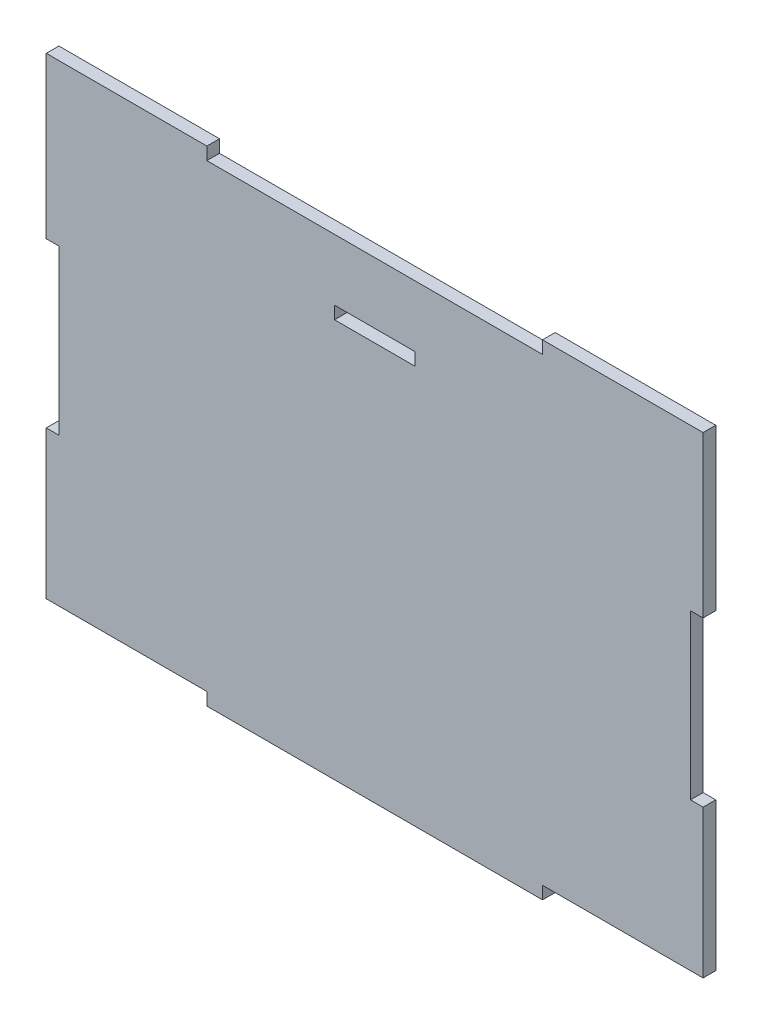
ISO-10303-21;
HEADER;
FILE_DESCRIPTION(('STEP AP214'),'2;1');
FILE_NAME('part.step','',(''),(''),'','','');
FILE_SCHEMA(('AUTOMOTIVE_DESIGN { 1 0 10303 214 1 1 1 1 }'));
ENDSEC;
DATA;
#1=APPLICATION_CONTEXT('core data for automotive mechanical design processes');
#2=APPLICATION_PROTOCOL_DEFINITION('international standard','automotive_design',2000,#1);
#3=PRODUCT_CONTEXT('',#1,'mechanical');
#4=PRODUCT('Part','Part','',(#3));
#5=PRODUCT_RELATED_PRODUCT_CATEGORY('part','',(#4));
#6=PRODUCT_DEFINITION_FORMATION('','',#4);
#7=PRODUCT_DEFINITION_CONTEXT('part definition',#1,'design');
#8=PRODUCT_DEFINITION('design','',#6,#7);
#9=PRODUCT_DEFINITION_SHAPE('','',#8);
#10=(LENGTH_UNIT() NAMED_UNIT(*) SI_UNIT(.MILLI.,.METRE.));
#11=(NAMED_UNIT(*) PLANE_ANGLE_UNIT() SI_UNIT($,.RADIAN.));
#12=(NAMED_UNIT(*) SI_UNIT($,.STERADIAN.) SOLID_ANGLE_UNIT());
#13=UNCERTAINTY_MEASURE_WITH_UNIT(LENGTH_MEASURE(1.E-05),#10,'distance_accuracy_value','');
#14=(GEOMETRIC_REPRESENTATION_CONTEXT(3) GLOBAL_UNCERTAINTY_ASSIGNED_CONTEXT((#13)) GLOBAL_UNIT_ASSIGNED_CONTEXT((#10,
#11,#12)) REPRESENTATION_CONTEXT('',''));
#15=CARTESIAN_POINT('',(0.,0.,0.));
#16=DIRECTION('',(0.,0.,1.));
#17=DIRECTION('',(1.,0.,0.));
#18=AXIS2_PLACEMENT_3D('',#15,#16,#17);
#19=CARTESIAN_POINT('',(0.,0.,2.));
#20=DIRECTION('',(0.,0.,-1.));
#21=DIRECTION('',(-1.,0.,0.));
#22=AXIS2_PLACEMENT_3D('',#19,#20,#21);
#23=PLANE('',#22);
#24=DIRECTION('',(0.,1.,0.));
#25=VECTOR('',#24,1.);
#26=CARTESIAN_POINT('',(51.943,12.954,2.));
#27=LINE('',#26,#25);
#28=CARTESIAN_POINT('',(51.943,12.954,2.));
#29=VERTEX_POINT('',#28);
#30=CARTESIAN_POINT('',(51.943,38.354,2.));
#31=VERTEX_POINT('',#30);
#32=EDGE_CURVE('E253',#29,#31,#27,.T.);
#33=ORIENTED_EDGE('',*,*,#32,.T.);
#34=DIRECTION('',(-1.,0.,0.));
#35=VECTOR('',#34,1.);
#36=CARTESIAN_POINT('',(26.543,38.354,2.));
#37=LINE('',#36,#35);
#38=CARTESIAN_POINT('',(26.543,38.354,2.));
#39=VERTEX_POINT('',#38);
#40=EDGE_CURVE('E257',#31,#39,#37,.T.);
#41=ORIENTED_EDGE('',*,*,#40,.T.);
#42=DIRECTION('',(0.,-1.,0.));
#43=VECTOR('',#42,1.);
#44=CARTESIAN_POINT('',(26.543,38.354,2.));
#45=LINE('',#44,#43);
#46=CARTESIAN_POINT('',(26.543,36.354,2.));
#47=VERTEX_POINT('',#46);
#48=EDGE_CURVE('E261',#39,#47,#45,.T.);
#49=ORIENTED_EDGE('',*,*,#48,.T.);
#50=DIRECTION('',(-1.,0.,0.));
#51=VECTOR('',#50,1.);
#52=CARTESIAN_POINT('',(-26.543,36.354,2.));
#53=LINE('',#52,#51);
#54=CARTESIAN_POINT('',(-26.543,36.354,2.));
#55=VERTEX_POINT('',#54);
#56=EDGE_CURVE('E264',#47,#55,#53,.T.);
#57=ORIENTED_EDGE('',*,*,#56,.T.);
#58=DIRECTION('',(0.,1.,0.));
#59=VECTOR('',#58,1.);
#60=CARTESIAN_POINT('',(-26.543,38.354,2.));
#61=LINE('',#60,#59);
#62=CARTESIAN_POINT('',(-26.543,38.354,2.));
#63=VERTEX_POINT('',#62);
#64=EDGE_CURVE('E267',#55,#63,#61,.T.);
#65=ORIENTED_EDGE('',*,*,#64,.T.);
#66=DIRECTION('',(-1.,0.,0.));
#67=VECTOR('',#66,1.);
#68=CARTESIAN_POINT('',(-51.943,38.354,2.));
#69=LINE('',#68,#67);
#70=CARTESIAN_POINT('',(-51.943,38.354,2.));
#71=VERTEX_POINT('',#70);
#72=EDGE_CURVE('E270',#63,#71,#69,.T.);
#73=ORIENTED_EDGE('',*,*,#72,.T.);
#74=DIRECTION('',(0.,-1.,0.));
#75=VECTOR('',#74,1.);
#76=CARTESIAN_POINT('',(-51.943,12.954,2.));
#77=LINE('',#76,#75);
#78=CARTESIAN_POINT('',(-51.943,12.954,2.));
#79=VERTEX_POINT('',#78);
#80=EDGE_CURVE('E273',#71,#79,#77,.T.);
#81=ORIENTED_EDGE('',*,*,#80,.T.);
#82=DIRECTION('',(1.,0.,0.));
#83=VECTOR('',#82,1.);
#84=CARTESIAN_POINT('',(-51.943,12.954,2.));
#85=LINE('',#84,#83);
#86=CARTESIAN_POINT('',(-49.943,12.954,2.));
#87=VERTEX_POINT('',#86);
#88=EDGE_CURVE('E276',#79,#87,#85,.T.);
#89=ORIENTED_EDGE('',*,*,#88,.T.);
#90=DIRECTION('',(0.,-1.,0.));
#91=VECTOR('',#90,1.);
#92=CARTESIAN_POINT('',(-49.943,-12.954,2.));
#93=LINE('',#92,#91);
#94=CARTESIAN_POINT('',(-49.943,-12.954,2.));
#95=VERTEX_POINT('',#94);
#96=EDGE_CURVE('E279',#87,#95,#93,.T.);
#97=ORIENTED_EDGE('',*,*,#96,.T.);
#98=DIRECTION('',(-1.,0.,0.));
#99=VECTOR('',#98,1.);
#100=CARTESIAN_POINT('',(-51.943,-12.954,2.));
#101=LINE('',#100,#99);
#102=CARTESIAN_POINT('',(-51.943,-12.954,2.));
#103=VERTEX_POINT('',#102);
#104=EDGE_CURVE('E282',#95,#103,#101,.T.);
#105=ORIENTED_EDGE('',*,*,#104,.T.);
#106=DIRECTION('',(0.,-1.,0.));
#107=VECTOR('',#106,1.);
#108=CARTESIAN_POINT('',(-51.943,-12.954,2.));
#109=LINE('',#108,#107);
#110=CARTESIAN_POINT('',(-51.943,-36.354,2.));
#111=VERTEX_POINT('',#110);
#112=EDGE_CURVE('E285',#103,#111,#109,.T.);
#113=ORIENTED_EDGE('',*,*,#112,.T.);
#114=DIRECTION('',(1.,0.,0.));
#115=VECTOR('',#114,1.);
#116=CARTESIAN_POINT('',(-51.943,-36.354,2.));
#117=LINE('',#116,#115);
#118=CARTESIAN_POINT('',(-26.543,-36.354,2.));
#119=VERTEX_POINT('',#118);
#120=EDGE_CURVE('E288',#111,#119,#117,.T.);
#121=ORIENTED_EDGE('',*,*,#120,.T.);
#122=DIRECTION('',(0.,-1.,0.));
#123=VECTOR('',#122,1.);
#124=CARTESIAN_POINT('',(-26.543,-36.354,2.));
#125=LINE('',#124,#123);
#126=CARTESIAN_POINT('',(-26.543,-38.354,2.));
#127=VERTEX_POINT('',#126);
#128=EDGE_CURVE('E291',#119,#127,#125,.T.);
#129=ORIENTED_EDGE('',*,*,#128,.T.);
#130=DIRECTION('',(1.,0.,0.));
#131=VECTOR('',#130,1.);
#132=CARTESIAN_POINT('',(-26.543,-38.354,2.));
#133=LINE('',#132,#131);
#134=CARTESIAN_POINT('',(26.543,-38.354,2.));
#135=VERTEX_POINT('',#134);
#136=EDGE_CURVE('E294',#127,#135,#133,.T.);
#137=ORIENTED_EDGE('',*,*,#136,.T.);
#138=DIRECTION('',(0.,1.,0.));
#139=VECTOR('',#138,1.);
#140=CARTESIAN_POINT('',(26.543,-36.354,2.));
#141=LINE('',#140,#139);
#142=CARTESIAN_POINT('',(26.543,-36.354,2.));
#143=VERTEX_POINT('',#142);
#144=EDGE_CURVE('E297',#135,#143,#141,.T.);
#145=ORIENTED_EDGE('',*,*,#144,.T.);
#146=DIRECTION('',(1.,0.,0.));
#147=VECTOR('',#146,1.);
#148=CARTESIAN_POINT('',(26.543,-36.354,2.));
#149=LINE('',#148,#147);
#150=CARTESIAN_POINT('',(51.943,-36.354,2.));
#151=VERTEX_POINT('',#150);
#152=EDGE_CURVE('E300',#143,#151,#149,.T.);
#153=ORIENTED_EDGE('',*,*,#152,.T.);
#154=DIRECTION('',(0.,1.,0.));
#155=VECTOR('',#154,1.);
#156=CARTESIAN_POINT('',(51.943,-36.354,2.));
#157=LINE('',#156,#155);
#158=CARTESIAN_POINT('',(51.943,-12.954,2.));
#159=VERTEX_POINT('',#158);
#160=EDGE_CURVE('E303',#151,#159,#157,.T.);
#161=ORIENTED_EDGE('',*,*,#160,.T.);
#162=DIRECTION('',(-1.,0.,0.));
#163=VECTOR('',#162,1.);
#164=CARTESIAN_POINT('',(49.943,-12.954,2.));
#165=LINE('',#164,#163);
#166=CARTESIAN_POINT('',(49.943,-12.954,2.));
#167=VERTEX_POINT('',#166);
#168=EDGE_CURVE('E306',#159,#167,#165,.T.);
#169=ORIENTED_EDGE('',*,*,#168,.T.);
#170=DIRECTION('',(0.,1.,0.));
#171=VECTOR('',#170,1.);
#172=CARTESIAN_POINT('',(49.943,-12.954,2.));
#173=LINE('',#172,#171);
#174=CARTESIAN_POINT('',(49.943,12.954,2.));
#175=VERTEX_POINT('',#174);
#176=EDGE_CURVE('E309',#167,#175,#173,.T.);
#177=ORIENTED_EDGE('',*,*,#176,.T.);
#178=DIRECTION('',(1.,0.,0.));
#179=VECTOR('',#178,1.);
#180=CARTESIAN_POINT('',(49.943,12.954,2.));
#181=LINE('',#180,#179);
#182=EDGE_CURVE('E312',#175,#29,#181,.T.);
#183=ORIENTED_EDGE('',*,*,#182,.T.);
#184=EDGE_LOOP('',(#33,#41,#49,#57,#65,#73,#81,#89,#97,#105,#113,#121,#129,#137,#145,#153,#161,
#169,#177,#183));
#185=FACE_BOUND('',#184,.T.);
#186=DIRECTION('',(0.,1.,0.));
#187=VECTOR('',#186,1.);
#188=CARTESIAN_POINT('',(6.35,24.654,2.));
#189=LINE('',#188,#187);
#190=CARTESIAN_POINT('',(6.35,24.654,2.));
#191=VERTEX_POINT('',#190);
#192=CARTESIAN_POINT('',(6.35,26.654,2.));
#193=VERTEX_POINT('',#192);
#194=EDGE_CURVE('E205',#191,#193,#189,.T.);
#195=ORIENTED_EDGE('',*,*,#194,.F.);
#196=DIRECTION('',(1.,0.,0.));
#197=VECTOR('',#196,1.);
#198=CARTESIAN_POINT('',(-6.34999999999999,24.654,2.));
#199=LINE('',#198,#197);
#200=CARTESIAN_POINT('',(-6.34999999999999,24.654,2.));
#201=VERTEX_POINT('',#200);
#202=EDGE_CURVE('E231',#201,#191,#199,.T.);
#203=ORIENTED_EDGE('',*,*,#202,.F.);
#204=DIRECTION('',(0.,-1.,0.));
#205=VECTOR('',#204,1.);
#206=CARTESIAN_POINT('',(-6.34999999999999,24.654,2.));
#207=LINE('',#206,#205);
#208=CARTESIAN_POINT('',(-6.34999999999999,26.654,2.));
#209=VERTEX_POINT('',#208);
#210=EDGE_CURVE('E227',#209,#201,#207,.T.);
#211=ORIENTED_EDGE('',*,*,#210,.F.);
#212=DIRECTION('',(-1.,0.,0.));
#213=VECTOR('',#212,1.);
#214=CARTESIAN_POINT('',(-6.34999999999999,26.654,2.));
#215=LINE('',#214,#213);
#216=EDGE_CURVE('E214',#193,#209,#215,.T.);
#217=ORIENTED_EDGE('',*,*,#216,.F.);
#218=EDGE_LOOP('',(#195,#203,#211,#217));
#219=FACE_BOUND('',#218,.T.);
#220=ADVANCED_FACE('F43',(#185,#219),#23,.F.);
#221=CARTESIAN_POINT('',(0.,0.,0.));
#222=DIRECTION('',(0.,0.,-1.));
#223=DIRECTION('',(-1.,0.,0.));
#224=AXIS2_PLACEMENT_3D('',#221,#222,#223);
#225=PLANE('',#224);
#226=DIRECTION('',(0.,1.,0.));
#227=VECTOR('',#226,1.);
#228=CARTESIAN_POINT('',(51.943,12.954,0.));
#229=LINE('',#228,#227);
#230=CARTESIAN_POINT('',(51.943,12.954,0.));
#231=VERTEX_POINT('',#230);
#232=CARTESIAN_POINT('',(51.943,38.354,0.));
#233=VERTEX_POINT('',#232);
#234=EDGE_CURVE('E223',#231,#233,#229,.T.);
#235=ORIENTED_EDGE('',*,*,#234,.F.);
#236=DIRECTION('',(1.,0.,0.));
#237=VECTOR('',#236,1.);
#238=CARTESIAN_POINT('',(49.943,12.954,0.));
#239=LINE('',#238,#237);
#240=CARTESIAN_POINT('',(49.943,12.954,0.));
#241=VERTEX_POINT('',#240);
#242=EDGE_CURVE('E258',#241,#231,#239,.T.);
#243=ORIENTED_EDGE('',*,*,#242,.F.);
#244=DIRECTION('',(0.,1.,0.));
#245=VECTOR('',#244,1.);
#246=CARTESIAN_POINT('',(49.943,-12.954,0.));
#247=LINE('',#246,#245);
#248=CARTESIAN_POINT('',(49.943,-12.954,0.));
#249=VERTEX_POINT('',#248);
#250=EDGE_CURVE('E372',#249,#241,#247,.T.);
#251=ORIENTED_EDGE('',*,*,#250,.F.);
#252=DIRECTION('',(-1.,0.,0.));
#253=VECTOR('',#252,1.);
#254=CARTESIAN_POINT('',(49.943,-12.954,0.));
#255=LINE('',#254,#253);
#256=CARTESIAN_POINT('',(51.943,-12.954,0.));
#257=VERTEX_POINT('',#256);
#258=EDGE_CURVE('E369',#257,#249,#255,.T.);
#259=ORIENTED_EDGE('',*,*,#258,.F.);
#260=DIRECTION('',(0.,1.,0.));
#261=VECTOR('',#260,1.);
#262=CARTESIAN_POINT('',(51.943,-36.354,0.));
#263=LINE('',#262,#261);
#264=CARTESIAN_POINT('',(51.943,-36.354,0.));
#265=VERTEX_POINT('',#264);
#266=EDGE_CURVE('E366',#265,#257,#263,.T.);
#267=ORIENTED_EDGE('',*,*,#266,.F.);
#268=DIRECTION('',(1.,0.,0.));
#269=VECTOR('',#268,1.);
#270=CARTESIAN_POINT('',(49.943,-36.354,0.));
#271=LINE('',#270,#269);
#272=CARTESIAN_POINT('',(26.543,-36.354,0.));
#273=VERTEX_POINT('',#272);
#274=EDGE_CURVE('E363',#273,#265,#271,.T.);
#275=ORIENTED_EDGE('',*,*,#274,.F.);
#276=DIRECTION('',(0.,1.,0.));
#277=VECTOR('',#276,1.);
#278=CARTESIAN_POINT('',(26.543,-36.354,0.));
#279=LINE('',#278,#277);
#280=CARTESIAN_POINT('',(26.543,-38.354,0.));
#281=VERTEX_POINT('',#280);
#282=EDGE_CURVE('E359',#281,#273,#279,.T.);
#283=ORIENTED_EDGE('',*,*,#282,.F.);
#284=DIRECTION('',(1.,0.,0.));
#285=VECTOR('',#284,1.);
#286=CARTESIAN_POINT('',(-26.543,-38.354,0.));
#287=LINE('',#286,#285);
#288=CARTESIAN_POINT('',(-26.543,-38.354,0.));
#289=VERTEX_POINT('',#288);
#290=EDGE_CURVE('E356',#289,#281,#287,.T.);
#291=ORIENTED_EDGE('',*,*,#290,.F.);
#292=DIRECTION('',(0.,-1.,0.));
#293=VECTOR('',#292,1.);
#294=CARTESIAN_POINT('',(-26.543,-36.354,0.));
#295=LINE('',#294,#293);
#296=CARTESIAN_POINT('',(-26.543,-36.354,0.));
#297=VERTEX_POINT('',#296);
#298=EDGE_CURVE('E353',#297,#289,#295,.T.);
#299=ORIENTED_EDGE('',*,*,#298,.F.);
#300=DIRECTION('',(1.,0.,0.));
#301=VECTOR('',#300,1.);
#302=CARTESIAN_POINT('',(-49.943,-36.354,0.));
#303=LINE('',#302,#301);
#304=CARTESIAN_POINT('',(-51.943,-36.354,0.));
#305=VERTEX_POINT('',#304);
#306=EDGE_CURVE('E350',#305,#297,#303,.T.);
#307=ORIENTED_EDGE('',*,*,#306,.F.);
#308=DIRECTION('',(0.,-1.,0.));
#309=VECTOR('',#308,1.);
#310=CARTESIAN_POINT('',(-51.943,-12.954,0.));
#311=LINE('',#310,#309);
#312=CARTESIAN_POINT('',(-51.943,-12.954,0.));
#313=VERTEX_POINT('',#312);
#314=EDGE_CURVE('E346',#313,#305,#311,.T.);
#315=ORIENTED_EDGE('',*,*,#314,.F.);
#316=DIRECTION('',(-1.,0.,0.));
#317=VECTOR('',#316,1.);
#318=CARTESIAN_POINT('',(-51.943,-12.954,0.));
#319=LINE('',#318,#317);
#320=CARTESIAN_POINT('',(-49.943,-12.954,0.));
#321=VERTEX_POINT('',#320);
#322=EDGE_CURVE('E343',#321,#313,#319,.T.);
#323=ORIENTED_EDGE('',*,*,#322,.F.);
#324=DIRECTION('',(0.,-1.,0.));
#325=VECTOR('',#324,1.);
#326=CARTESIAN_POINT('',(-49.943,-12.954,0.));
#327=LINE('',#326,#325);
#328=CARTESIAN_POINT('',(-49.943,12.954,0.));
#329=VERTEX_POINT('',#328);
#330=EDGE_CURVE('E340',#329,#321,#327,.T.);
#331=ORIENTED_EDGE('',*,*,#330,.F.);
#332=DIRECTION('',(1.,0.,0.));
#333=VECTOR('',#332,1.);
#334=CARTESIAN_POINT('',(-51.943,12.954,0.));
#335=LINE('',#334,#333);
#336=CARTESIAN_POINT('',(-51.943,12.954,0.));
#337=VERTEX_POINT('',#336);
#338=EDGE_CURVE('E337',#337,#329,#335,.T.);
#339=ORIENTED_EDGE('',*,*,#338,.F.);
#340=DIRECTION('',(0.,-1.,0.));
#341=VECTOR('',#340,1.);
#342=CARTESIAN_POINT('',(-51.943,12.954,0.));
#343=LINE('',#342,#341);
#344=CARTESIAN_POINT('',(-51.943,38.354,0.));
#345=VERTEX_POINT('',#344);
#346=EDGE_CURVE('E334',#345,#337,#343,.T.);
#347=ORIENTED_EDGE('',*,*,#346,.F.);
#348=DIRECTION('',(-1.,0.,0.));
#349=VECTOR('',#348,1.);
#350=CARTESIAN_POINT('',(-51.943,38.354,0.));
#351=LINE('',#350,#349);
#352=CARTESIAN_POINT('',(-26.543,38.354,0.));
#353=VERTEX_POINT('',#352);
#354=EDGE_CURVE('E331',#353,#345,#351,.T.);
#355=ORIENTED_EDGE('',*,*,#354,.F.);
#356=DIRECTION('',(0.,1.,0.));
#357=VECTOR('',#356,1.);
#358=CARTESIAN_POINT('',(-26.543,38.354,0.));
#359=LINE('',#358,#357);
#360=CARTESIAN_POINT('',(-26.543,36.354,0.));
#361=VERTEX_POINT('',#360);
#362=EDGE_CURVE('E328',#361,#353,#359,.T.);
#363=ORIENTED_EDGE('',*,*,#362,.F.);
#364=DIRECTION('',(-1.,0.,0.));
#365=VECTOR('',#364,1.);
#366=CARTESIAN_POINT('',(-26.543,36.354,0.));
#367=LINE('',#366,#365);
#368=CARTESIAN_POINT('',(26.543,36.354,0.));
#369=VERTEX_POINT('',#368);
#370=EDGE_CURVE('E325',#369,#361,#367,.T.);
#371=ORIENTED_EDGE('',*,*,#370,.F.);
#372=DIRECTION('',(0.,-1.,0.));
#373=VECTOR('',#372,1.);
#374=CARTESIAN_POINT('',(26.543,38.354,0.));
#375=LINE('',#374,#373);
#376=CARTESIAN_POINT('',(26.543,38.354,0.));
#377=VERTEX_POINT('',#376);
#378=EDGE_CURVE('E322',#377,#369,#375,.T.);
#379=ORIENTED_EDGE('',*,*,#378,.F.);
#380=DIRECTION('',(-1.,0.,0.));
#381=VECTOR('',#380,1.);
#382=CARTESIAN_POINT('',(26.543,38.354,0.));
#383=LINE('',#382,#381);
#384=EDGE_CURVE('E319',#233,#377,#383,.T.);
#385=ORIENTED_EDGE('',*,*,#384,.F.);
#386=EDGE_LOOP('',(#235,#243,#251,#259,#267,#275,#283,#291,#299,#307,#315,#323,#331,#339,#347,
#355,#363,#371,#379,#385));
#387=FACE_BOUND('',#386,.T.);
#388=DIRECTION('',(1.,0.,0.));
#389=VECTOR('',#388,1.);
#390=CARTESIAN_POINT('',(-6.34999999999999,24.654,0.));
#391=LINE('',#390,#389);
#392=CARTESIAN_POINT('',(-6.34999999999999,24.654,0.));
#393=VERTEX_POINT('',#392);
#394=CARTESIAN_POINT('',(6.35,24.654,0.));
#395=VERTEX_POINT('',#394);
#396=EDGE_CURVE('E215',#393,#395,#391,.T.);
#397=ORIENTED_EDGE('',*,*,#396,.T.);
#398=DIRECTION('',(0.,1.,0.));
#399=VECTOR('',#398,1.);
#400=CARTESIAN_POINT('',(6.35,24.654,0.));
#401=LINE('',#400,#399);
#402=CARTESIAN_POINT('',(6.35,26.654,0.));
#403=VERTEX_POINT('',#402);
#404=EDGE_CURVE('E67',#395,#403,#401,.T.);
#405=ORIENTED_EDGE('',*,*,#404,.T.);
#406=DIRECTION('',(-1.,0.,0.));
#407=VECTOR('',#406,1.);
#408=CARTESIAN_POINT('',(-6.34999999999999,26.654,0.));
#409=LINE('',#408,#407);
#410=CARTESIAN_POINT('',(-6.34999999999999,26.654,0.));
#411=VERTEX_POINT('',#410);
#412=EDGE_CURVE('E221',#403,#411,#409,.T.);
#413=ORIENTED_EDGE('',*,*,#412,.T.);
#414=DIRECTION('',(0.,-1.,0.));
#415=VECTOR('',#414,1.);
#416=CARTESIAN_POINT('',(-6.34999999999999,24.654,0.));
#417=LINE('',#416,#415);
#418=EDGE_CURVE('E240',#411,#393,#417,.T.);
#419=ORIENTED_EDGE('',*,*,#418,.T.);
#420=EDGE_LOOP('',(#397,#405,#413,#419));
#421=FACE_BOUND('',#420,.T.);
#422=ADVANCED_FACE('F459',(#387,#421),#225,.T.);
#423=CARTESIAN_POINT('',(51.943,12.954,2.));
#424=DIRECTION('',(-1.,0.,0.));
#425=DIRECTION('',(0.,-1.,0.));
#426=AXIS2_PLACEMENT_3D('',#423,#424,#425);
#427=PLANE('',#426);
#428=ORIENTED_EDGE('',*,*,#234,.T.);
#429=DIRECTION('',(0.,0.,-1.));
#430=VECTOR('',#429,1.);
#431=CARTESIAN_POINT('',(51.943,38.354,2.));
#432=LINE('',#431,#430);
#433=EDGE_CURVE('E11',#31,#233,#432,.T.);
#434=ORIENTED_EDGE('',*,*,#433,.F.);
#435=ORIENTED_EDGE('',*,*,#32,.F.);
#436=DIRECTION('',(0.,0.,-1.));
#437=VECTOR('',#436,1.);
#438=CARTESIAN_POINT('',(51.943,12.954,2.));
#439=LINE('',#438,#437);
#440=EDGE_CURVE('E315',#29,#231,#439,.T.);
#441=ORIENTED_EDGE('',*,*,#440,.T.);
#442=EDGE_LOOP('',(#428,#434,#435,#441));
#443=FACE_BOUND('',#442,.T.);
#444=ADVANCED_FACE('F45',(#443),#427,.F.);
#445=CARTESIAN_POINT('',(26.543,38.354,2.));
#446=DIRECTION('',(0.,-1.,0.));
#447=DIRECTION('',(0.,0.,-1.));
#448=AXIS2_PLACEMENT_3D('',#445,#446,#447);
#449=PLANE('',#448);
#450=ORIENTED_EDGE('',*,*,#384,.T.);
#451=DIRECTION('',(0.,0.,-1.));
#452=VECTOR('',#451,1.);
#453=CARTESIAN_POINT('',(26.543,38.354,2.));
#454=LINE('',#453,#452);
#455=EDGE_CURVE('E52',#39,#377,#454,.T.);
#456=ORIENTED_EDGE('',*,*,#455,.F.);
#457=ORIENTED_EDGE('',*,*,#40,.F.);
#458=ORIENTED_EDGE('',*,*,#433,.T.);
#459=EDGE_LOOP('',(#450,#456,#457,#458));
#460=FACE_BOUND('',#459,.T.);
#461=ADVANCED_FACE('F476',(#460),#449,.F.);
#462=CARTESIAN_POINT('',(26.543,38.354,2.));
#463=DIRECTION('',(1.,0.,0.));
#464=DIRECTION('',(0.,1.,0.));
#465=AXIS2_PLACEMENT_3D('',#462,#463,#464);
#466=PLANE('',#465);
#467=ORIENTED_EDGE('',*,*,#378,.T.);
#468=DIRECTION('',(0.,0.,-1.));
#469=VECTOR('',#468,1.);
#470=CARTESIAN_POINT('',(26.543,36.354,2.));
#471=LINE('',#470,#469);
#472=EDGE_CURVE('E444',#47,#369,#471,.T.);
#473=ORIENTED_EDGE('',*,*,#472,.F.);
#474=ORIENTED_EDGE('',*,*,#48,.F.);
#475=ORIENTED_EDGE('',*,*,#455,.T.);
#476=EDGE_LOOP('',(#467,#473,#474,#475));
#477=FACE_BOUND('',#476,.T.);
#478=ADVANCED_FACE('F453',(#477),#466,.F.);
#479=CARTESIAN_POINT('',(-26.543,36.354,2.));
#480=DIRECTION('',(0.,-1.,0.));
#481=DIRECTION('',(0.,0.,-1.));
#482=AXIS2_PLACEMENT_3D('',#479,#480,#481);
#483=PLANE('',#482);
#484=ORIENTED_EDGE('',*,*,#370,.T.);
#485=DIRECTION('',(0.,0.,-1.));
#486=VECTOR('',#485,1.);
#487=CARTESIAN_POINT('',(-26.543,36.354,2.));
#488=LINE('',#487,#486);
#489=EDGE_CURVE('E440',#55,#361,#488,.T.);
#490=ORIENTED_EDGE('',*,*,#489,.F.);
#491=ORIENTED_EDGE('',*,*,#56,.F.);
#492=ORIENTED_EDGE('',*,*,#472,.T.);
#493=EDGE_LOOP('',(#484,#490,#491,#492));
#494=FACE_BOUND('',#493,.T.);
#495=ADVANCED_FACE('F465',(#494),#483,.F.);
#496=CARTESIAN_POINT('',(-26.543,38.354,2.));
#497=DIRECTION('',(-1.,0.,0.));
#498=DIRECTION('',(0.,0.,1.));
#499=AXIS2_PLACEMENT_3D('',#496,#497,#498);
#500=PLANE('',#499);
#501=ORIENTED_EDGE('',*,*,#362,.T.);
#502=DIRECTION('',(0.,0.,-1.));
#503=VECTOR('',#502,1.);
#504=CARTESIAN_POINT('',(-26.543,38.354,2.));
#505=LINE('',#504,#503);
#506=EDGE_CURVE('E436',#63,#353,#505,.T.);
#507=ORIENTED_EDGE('',*,*,#506,.F.);
#508=ORIENTED_EDGE('',*,*,#64,.F.);
#509=ORIENTED_EDGE('',*,*,#489,.T.);
#510=EDGE_LOOP('',(#501,#507,#508,#509));
#511=FACE_BOUND('',#510,.T.);
#512=ADVANCED_FACE('F469',(#511),#500,.F.);
#513=CARTESIAN_POINT('',(-51.943,38.354,2.));
#514=DIRECTION('',(0.,-1.,0.));
#515=DIRECTION('',(0.,0.,-1.));
#516=AXIS2_PLACEMENT_3D('',#513,#514,#515);
#517=PLANE('',#516);
#518=ORIENTED_EDGE('',*,*,#354,.T.);
#519=DIRECTION('',(0.,0.,-1.));
#520=VECTOR('',#519,1.);
#521=CARTESIAN_POINT('',(-51.943,38.354,2.));
#522=LINE('',#521,#520);
#523=EDGE_CURVE('E432',#71,#345,#522,.T.);
#524=ORIENTED_EDGE('',*,*,#523,.F.);
#525=ORIENTED_EDGE('',*,*,#72,.F.);
#526=ORIENTED_EDGE('',*,*,#506,.T.);
#527=EDGE_LOOP('',(#518,#524,#525,#526));
#528=FACE_BOUND('',#527,.T.);
#529=ADVANCED_FACE('F547',(#528),#517,.F.);
#530=CARTESIAN_POINT('',(-51.943,12.954,2.));
#531=DIRECTION('',(1.,0.,0.));
#532=DIRECTION('',(0.,1.,0.));
#533=AXIS2_PLACEMENT_3D('',#530,#531,#532);
#534=PLANE('',#533);
#535=ORIENTED_EDGE('',*,*,#346,.T.);
#536=DIRECTION('',(0.,0.,-1.));
#537=VECTOR('',#536,1.);
#538=CARTESIAN_POINT('',(-51.943,12.954,2.));
#539=LINE('',#538,#537);
#540=EDGE_CURVE('E428',#79,#337,#539,.T.);
#541=ORIENTED_EDGE('',*,*,#540,.F.);
#542=ORIENTED_EDGE('',*,*,#80,.F.);
#543=ORIENTED_EDGE('',*,*,#523,.T.);
#544=EDGE_LOOP('',(#535,#541,#542,#543));
#545=FACE_BOUND('',#544,.T.);
#546=ADVANCED_FACE('F545',(#545),#534,.F.);
#547=CARTESIAN_POINT('',(-51.943,12.954,2.));
#548=DIRECTION('',(0.,1.,0.));
#549=DIRECTION('',(0.,0.,1.));
#550=AXIS2_PLACEMENT_3D('',#547,#548,#549);
#551=PLANE('',#550);
#552=ORIENTED_EDGE('',*,*,#338,.T.);
#553=DIRECTION('',(0.,0.,-1.));
#554=VECTOR('',#553,1.);
#555=CARTESIAN_POINT('',(-49.943,12.954,2.));
#556=LINE('',#555,#554);
#557=EDGE_CURVE('E424',#87,#329,#556,.T.);
#558=ORIENTED_EDGE('',*,*,#557,.F.);
#559=ORIENTED_EDGE('',*,*,#88,.F.);
#560=ORIENTED_EDGE('',*,*,#540,.T.);
#561=EDGE_LOOP('',(#552,#558,#559,#560));
#562=FACE_BOUND('',#561,.T.);
#563=ADVANCED_FACE('F541',(#562),#551,.F.);
#564=CARTESIAN_POINT('',(-49.943,-12.954,2.));
#565=DIRECTION('',(1.,0.,0.));
#566=DIRECTION('',(0.,0.,-1.));
#567=AXIS2_PLACEMENT_3D('',#564,#565,#566);
#568=PLANE('',#567);
#569=ORIENTED_EDGE('',*,*,#330,.T.);
#570=DIRECTION('',(0.,0.,-1.));
#571=VECTOR('',#570,1.);
#572=CARTESIAN_POINT('',(-49.943,-12.954,2.));
#573=LINE('',#572,#571);
#574=EDGE_CURVE('E420',#95,#321,#573,.T.);
#575=ORIENTED_EDGE('',*,*,#574,.F.);
#576=ORIENTED_EDGE('',*,*,#96,.F.);
#577=ORIENTED_EDGE('',*,*,#557,.T.);
#578=EDGE_LOOP('',(#569,#575,#576,#577));
#579=FACE_BOUND('',#578,.T.);
#580=ADVANCED_FACE('F536',(#579),#568,.F.);
#581=CARTESIAN_POINT('',(-51.943,-12.954,2.));
#582=DIRECTION('',(0.,-1.,0.));
#583=DIRECTION('',(0.,0.,-1.));
#584=AXIS2_PLACEMENT_3D('',#581,#582,#583);
#585=PLANE('',#584);
#586=ORIENTED_EDGE('',*,*,#322,.T.);
#587=DIRECTION('',(0.,0.,-1.));
#588=VECTOR('',#587,1.);
#589=CARTESIAN_POINT('',(-51.943,-12.954,2.));
#590=LINE('',#589,#588);
#591=EDGE_CURVE('E416',#103,#313,#590,.T.);
#592=ORIENTED_EDGE('',*,*,#591,.F.);
#593=ORIENTED_EDGE('',*,*,#104,.F.);
#594=ORIENTED_EDGE('',*,*,#574,.T.);
#595=EDGE_LOOP('',(#586,#592,#593,#594));
#596=FACE_BOUND('',#595,.T.);
#597=ADVANCED_FACE('F530',(#596),#585,.F.);
#598=CARTESIAN_POINT('',(-51.943,-12.954,2.));
#599=DIRECTION('',(1.,0.,0.));
#600=DIRECTION('',(0.,0.,-1.));
#601=AXIS2_PLACEMENT_3D('',#598,#599,#600);
#602=PLANE('',#601);
#603=ORIENTED_EDGE('',*,*,#314,.T.);
#604=DIRECTION('',(0.,0.,-1.));
#605=VECTOR('',#604,1.);
#606=CARTESIAN_POINT('',(-51.943,-36.354,2.));
#607=LINE('',#606,#605);
#608=EDGE_CURVE('E412',#111,#305,#607,.T.);
#609=ORIENTED_EDGE('',*,*,#608,.F.);
#610=ORIENTED_EDGE('',*,*,#112,.F.);
#611=ORIENTED_EDGE('',*,*,#591,.T.);
#612=EDGE_LOOP('',(#603,#609,#610,#611));
#613=FACE_BOUND('',#612,.T.);
#614=ADVANCED_FACE('F525',(#613),#602,.F.);
#615=CARTESIAN_POINT('',(-49.943,-36.354,2.));
#616=DIRECTION('',(0.,1.,0.));
#617=DIRECTION('',(0.,0.,1.));
#618=AXIS2_PLACEMENT_3D('',#615,#616,#617);
#619=PLANE('',#618);
#620=ORIENTED_EDGE('',*,*,#306,.T.);
#621=DIRECTION('',(0.,0.,-1.));
#622=VECTOR('',#621,1.);
#623=CARTESIAN_POINT('',(-26.543,-36.354,2.));
#624=LINE('',#623,#622);
#625=EDGE_CURVE('E408',#119,#297,#624,.T.);
#626=ORIENTED_EDGE('',*,*,#625,.F.);
#627=ORIENTED_EDGE('',*,*,#120,.F.);
#628=ORIENTED_EDGE('',*,*,#608,.T.);
#629=EDGE_LOOP('',(#620,#626,#627,#628));
#630=FACE_BOUND('',#629,.T.);
#631=ADVANCED_FACE('F520',(#630),#619,.F.);
#632=CARTESIAN_POINT('',(-26.543,-36.354,2.));
#633=DIRECTION('',(1.,0.,0.));
#634=DIRECTION('',(0.,0.,-1.));
#635=AXIS2_PLACEMENT_3D('',#632,#633,#634);
#636=PLANE('',#635);
#637=ORIENTED_EDGE('',*,*,#298,.T.);
#638=DIRECTION('',(0.,0.,-1.));
#639=VECTOR('',#638,1.);
#640=CARTESIAN_POINT('',(-26.543,-38.354,2.));
#641=LINE('',#640,#639);
#642=EDGE_CURVE('E404',#127,#289,#641,.T.);
#643=ORIENTED_EDGE('',*,*,#642,.F.);
#644=ORIENTED_EDGE('',*,*,#128,.F.);
#645=ORIENTED_EDGE('',*,*,#625,.T.);
#646=EDGE_LOOP('',(#637,#643,#644,#645));
#647=FACE_BOUND('',#646,.T.);
#648=ADVANCED_FACE('F516',(#647),#636,.F.);
#649=CARTESIAN_POINT('',(-26.543,-38.354,2.));
#650=DIRECTION('',(0.,1.,0.));
#651=DIRECTION('',(0.,0.,1.));
#652=AXIS2_PLACEMENT_3D('',#649,#650,#651);
#653=PLANE('',#652);
#654=ORIENTED_EDGE('',*,*,#290,.T.);
#655=DIRECTION('',(0.,0.,-1.));
#656=VECTOR('',#655,1.);
#657=CARTESIAN_POINT('',(26.543,-38.354,2.));
#658=LINE('',#657,#656);
#659=EDGE_CURVE('E400',#135,#281,#658,.T.);
#660=ORIENTED_EDGE('',*,*,#659,.F.);
#661=ORIENTED_EDGE('',*,*,#136,.F.);
#662=ORIENTED_EDGE('',*,*,#642,.T.);
#663=EDGE_LOOP('',(#654,#660,#661,#662));
#664=FACE_BOUND('',#663,.T.);
#665=ADVANCED_FACE('F511',(#664),#653,.F.);
#666=CARTESIAN_POINT('',(26.543,-36.354,2.));
#667=DIRECTION('',(-1.,0.,0.));
#668=DIRECTION('',(0.,-1.,0.));
#669=AXIS2_PLACEMENT_3D('',#666,#667,#668);
#670=PLANE('',#669);
#671=ORIENTED_EDGE('',*,*,#282,.T.);
#672=DIRECTION('',(0.,0.,-1.));
#673=VECTOR('',#672,1.);
#674=CARTESIAN_POINT('',(26.543,-36.354,2.));
#675=LINE('',#674,#673);
#676=EDGE_CURVE('E396',#143,#273,#675,.T.);
#677=ORIENTED_EDGE('',*,*,#676,.F.);
#678=ORIENTED_EDGE('',*,*,#144,.F.);
#679=ORIENTED_EDGE('',*,*,#659,.T.);
#680=EDGE_LOOP('',(#671,#677,#678,#679));
#681=FACE_BOUND('',#680,.T.);
#682=ADVANCED_FACE('F506',(#681),#670,.F.);
#683=CARTESIAN_POINT('',(49.943,-36.354,2.));
#684=DIRECTION('',(0.,1.,0.));
#685=DIRECTION('',(0.,0.,1.));
#686=AXIS2_PLACEMENT_3D('',#683,#684,#685);
#687=PLANE('',#686);
#688=ORIENTED_EDGE('',*,*,#274,.T.);
#689=DIRECTION('',(0.,0.,-1.));
#690=VECTOR('',#689,1.);
#691=CARTESIAN_POINT('',(51.943,-36.354,2.));
#692=LINE('',#691,#690);
#693=EDGE_CURVE('E392',#151,#265,#692,.T.);
#694=ORIENTED_EDGE('',*,*,#693,.F.);
#695=ORIENTED_EDGE('',*,*,#152,.F.);
#696=ORIENTED_EDGE('',*,*,#676,.T.);
#697=EDGE_LOOP('',(#688,#694,#695,#696));
#698=FACE_BOUND('',#697,.T.);
#699=ADVANCED_FACE('F502',(#698),#687,.F.);
#700=CARTESIAN_POINT('',(51.943,-36.354,2.));
#701=DIRECTION('',(-1.,0.,0.));
#702=DIRECTION('',(0.,-1.,0.));
#703=AXIS2_PLACEMENT_3D('',#700,#701,#702);
#704=PLANE('',#703);
#705=ORIENTED_EDGE('',*,*,#266,.T.);
#706=DIRECTION('',(0.,0.,-1.));
#707=VECTOR('',#706,1.);
#708=CARTESIAN_POINT('',(51.943,-12.954,2.));
#709=LINE('',#708,#707);
#710=EDGE_CURVE('E388',#159,#257,#709,.T.);
#711=ORIENTED_EDGE('',*,*,#710,.F.);
#712=ORIENTED_EDGE('',*,*,#160,.F.);
#713=ORIENTED_EDGE('',*,*,#693,.T.);
#714=EDGE_LOOP('',(#705,#711,#712,#713));
#715=FACE_BOUND('',#714,.T.);
#716=ADVANCED_FACE('F497',(#715),#704,.F.);
#717=CARTESIAN_POINT('',(49.943,-12.954,2.));
#718=DIRECTION('',(0.,-1.,0.));
#719=DIRECTION('',(0.,0.,-1.));
#720=AXIS2_PLACEMENT_3D('',#717,#718,#719);
#721=PLANE('',#720);
#722=ORIENTED_EDGE('',*,*,#258,.T.);
#723=DIRECTION('',(0.,0.,-1.));
#724=VECTOR('',#723,1.);
#725=CARTESIAN_POINT('',(49.943,-12.954,2.));
#726=LINE('',#725,#724);
#727=EDGE_CURVE('E384',#167,#249,#726,.T.);
#728=ORIENTED_EDGE('',*,*,#727,.F.);
#729=ORIENTED_EDGE('',*,*,#168,.F.);
#730=ORIENTED_EDGE('',*,*,#710,.T.);
#731=EDGE_LOOP('',(#722,#728,#729,#730));
#732=FACE_BOUND('',#731,.T.);
#733=ADVANCED_FACE('F492',(#732),#721,.F.);
#734=CARTESIAN_POINT('',(49.943,-12.954,2.));
#735=DIRECTION('',(-1.,0.,0.));
#736=DIRECTION('',(0.,-1.,0.));
#737=AXIS2_PLACEMENT_3D('',#734,#735,#736);
#738=PLANE('',#737);
#739=ORIENTED_EDGE('',*,*,#250,.T.);
#740=DIRECTION('',(0.,0.,-1.));
#741=VECTOR('',#740,1.);
#742=CARTESIAN_POINT('',(49.943,12.954,2.));
#743=LINE('',#742,#741);
#744=EDGE_CURVE('E380',#175,#241,#743,.T.);
#745=ORIENTED_EDGE('',*,*,#744,.F.);
#746=ORIENTED_EDGE('',*,*,#176,.F.);
#747=ORIENTED_EDGE('',*,*,#727,.T.);
#748=EDGE_LOOP('',(#739,#745,#746,#747));
#749=FACE_BOUND('',#748,.T.);
#750=ADVANCED_FACE('F488',(#749),#738,.F.);
#751=CARTESIAN_POINT('',(49.943,12.954,2.));
#752=DIRECTION('',(0.,1.,0.));
#753=DIRECTION('',(-1.,0.,0.));
#754=AXIS2_PLACEMENT_3D('',#751,#752,#753);
#755=PLANE('',#754);
#756=ORIENTED_EDGE('',*,*,#242,.T.);
#757=ORIENTED_EDGE('',*,*,#440,.F.);
#758=ORIENTED_EDGE('',*,*,#182,.F.);
#759=ORIENTED_EDGE('',*,*,#744,.T.);
#760=EDGE_LOOP('',(#756,#757,#758,#759));
#761=FACE_BOUND('',#760,.T.);
#762=ADVANCED_FACE('F483',(#761),#755,.F.);
#763=CARTESIAN_POINT('',(6.35,24.654,2.));
#764=DIRECTION('',(-1.,0.,0.));
#765=DIRECTION('',(0.,0.,1.));
#766=AXIS2_PLACEMENT_3D('',#763,#764,#765);
#767=PLANE('',#766);
#768=ORIENTED_EDGE('',*,*,#404,.F.);
#769=DIRECTION('',(0.,0.,-1.));
#770=VECTOR('',#769,1.);
#771=CARTESIAN_POINT('',(6.35,24.654,2.));
#772=LINE('',#771,#770);
#773=EDGE_CURVE('E209',#191,#395,#772,.T.);
#774=ORIENTED_EDGE('',*,*,#773,.F.);
#775=ORIENTED_EDGE('',*,*,#194,.T.);
#776=DIRECTION('',(0.,0.,-1.));
#777=VECTOR('',#776,1.);
#778=CARTESIAN_POINT('',(6.35,26.654,2.));
#779=LINE('',#778,#777);
#780=EDGE_CURVE('E208',#193,#403,#779,.T.);
#781=ORIENTED_EDGE('',*,*,#780,.T.);
#782=EDGE_LOOP('',(#768,#774,#775,#781));
#783=FACE_BOUND('',#782,.T.);
#784=ADVANCED_FACE('F207',(#783),#767,.T.);
#785=CARTESIAN_POINT('',(-6.34999999999999,26.654,2.));
#786=DIRECTION('',(0.,-1.,0.));
#787=DIRECTION('',(0.,0.,-1.));
#788=AXIS2_PLACEMENT_3D('',#785,#786,#787);
#789=PLANE('',#788);
#790=ORIENTED_EDGE('',*,*,#412,.F.);
#791=ORIENTED_EDGE('',*,*,#780,.F.);
#792=ORIENTED_EDGE('',*,*,#216,.T.);
#793=DIRECTION('',(0.,0.,-1.));
#794=VECTOR('',#793,1.);
#795=CARTESIAN_POINT('',(-6.34999999999999,26.654,2.));
#796=LINE('',#795,#794);
#797=EDGE_CURVE('E224',#209,#411,#796,.T.);
#798=ORIENTED_EDGE('',*,*,#797,.T.);
#799=EDGE_LOOP('',(#790,#791,#792,#798));
#800=FACE_BOUND('',#799,.T.);
#801=ADVANCED_FACE('F218',(#800),#789,.T.);
#802=CARTESIAN_POINT('',(-6.34999999999999,24.654,2.));
#803=DIRECTION('',(1.,0.,0.));
#804=DIRECTION('',(0.,0.,-1.));
#805=AXIS2_PLACEMENT_3D('',#802,#803,#804);
#806=PLANE('',#805);
#807=ORIENTED_EDGE('',*,*,#418,.F.);
#808=ORIENTED_EDGE('',*,*,#797,.F.);
#809=ORIENTED_EDGE('',*,*,#210,.T.);
#810=DIRECTION('',(0.,0.,-1.));
#811=VECTOR('',#810,1.);
#812=CARTESIAN_POINT('',(-6.34999999999999,24.654,2.));
#813=LINE('',#812,#811);
#814=EDGE_CURVE('E59',#201,#393,#813,.T.);
#815=ORIENTED_EDGE('',*,*,#814,.T.);
#816=EDGE_LOOP('',(#807,#808,#809,#815));
#817=FACE_BOUND('',#816,.T.);
#818=ADVANCED_FACE('F653',(#817),#806,.T.);
#819=CARTESIAN_POINT('',(-6.34999999999999,24.654,2.));
#820=DIRECTION('',(0.,1.,0.));
#821=DIRECTION('',(0.,0.,1.));
#822=AXIS2_PLACEMENT_3D('',#819,#820,#821);
#823=PLANE('',#822);
#824=ORIENTED_EDGE('',*,*,#396,.F.);
#825=ORIENTED_EDGE('',*,*,#814,.F.);
#826=ORIENTED_EDGE('',*,*,#202,.T.);
#827=ORIENTED_EDGE('',*,*,#773,.T.);
#828=EDGE_LOOP('',(#824,#825,#826,#827));
#829=FACE_BOUND('',#828,.T.);
#830=ADVANCED_FACE('F659',(#829),#823,.T.);
#831=CLOSED_SHELL('',(#220,#422,#444,#461,#478,#495,#512,#529,#546,#563,#580,#597,#614,#631,
#648,#665,#682,#699,#716,#733,#750,#762,#784,#801,#818,#830));
#832=MANIFOLD_SOLID_BREP('B2',#831);
#833=ADVANCED_BREP_SHAPE_REPRESENTATION('',(#18,#832),#14);
#834=SHAPE_DEFINITION_REPRESENTATION(#9,#833);
ENDSEC;
END-ISO-10303-21;
